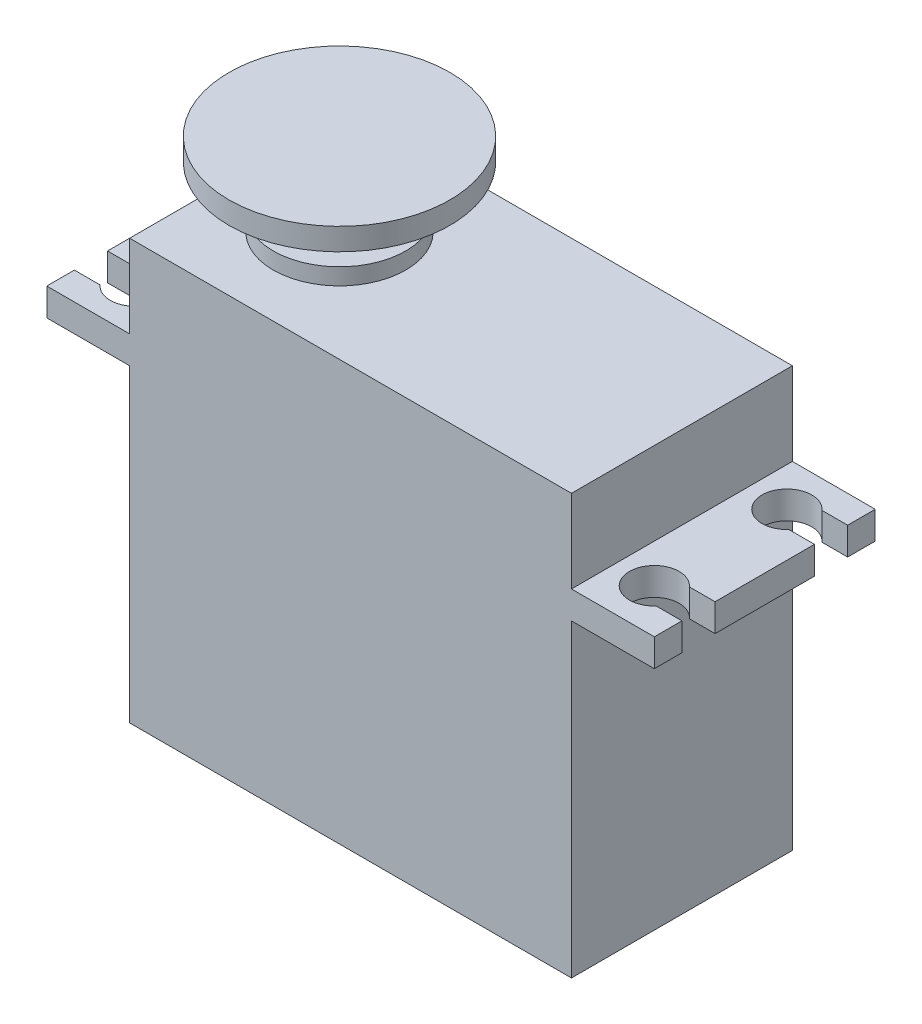
ISO-10303-21;
HEADER;
FILE_DESCRIPTION(('STEP AP214'),'2;1');
FILE_NAME('part.step','',(''),(''),'','','');
FILE_SCHEMA(('AUTOMOTIVE_DESIGN { 1 0 10303 214 1 1 1 1 }'));
ENDSEC;
DATA;
#1=APPLICATION_CONTEXT('core data for automotive mechanical design processes');
#2=APPLICATION_PROTOCOL_DEFINITION('international standard','automotive_design',2000,#1);
#3=PRODUCT_CONTEXT('',#1,'mechanical');
#4=PRODUCT('Part','Part','',(#3));
#5=PRODUCT_RELATED_PRODUCT_CATEGORY('part','',(#4));
#6=PRODUCT_DEFINITION_FORMATION('','',#4);
#7=PRODUCT_DEFINITION_CONTEXT('part definition',#1,'design');
#8=PRODUCT_DEFINITION('design','',#6,#7);
#9=PRODUCT_DEFINITION_SHAPE('','',#8);
#10=(LENGTH_UNIT() NAMED_UNIT(*) SI_UNIT(.MILLI.,.METRE.));
#11=(NAMED_UNIT(*) PLANE_ANGLE_UNIT() SI_UNIT($,.RADIAN.));
#12=(NAMED_UNIT(*) SI_UNIT($,.STERADIAN.) SOLID_ANGLE_UNIT());
#13=UNCERTAINTY_MEASURE_WITH_UNIT(LENGTH_MEASURE(1.E-05),#10,'distance_accuracy_value','');
#14=(GEOMETRIC_REPRESENTATION_CONTEXT(3) GLOBAL_UNCERTAINTY_ASSIGNED_CONTEXT((#13)) GLOBAL_UNIT_ASSIGNED_CONTEXT((#10,
#11,#12)) REPRESENTATION_CONTEXT('',''));
#15=CARTESIAN_POINT('',(0.,0.,0.));
#16=DIRECTION('',(0.,0.,1.));
#17=DIRECTION('',(1.,0.,0.));
#18=AXIS2_PLACEMENT_3D('',#15,#16,#17);
#19=CARTESIAN_POINT('',(-11.,45.5,0.));
#20=DIRECTION('',(0.,-1.,0.));
#21=DIRECTION('',(0.,0.,-1.));
#22=AXIS2_PLACEMENT_3D('',#19,#20,#21);
#23=CYLINDRICAL_SURFACE('',#22,10.);
#24=CARTESIAN_POINT('',(-11.,45.5,0.));
#25=DIRECTION('',(0.,1.,0.));
#26=DIRECTION('',(0.,0.,1.));
#27=AXIS2_PLACEMENT_3D('',#24,#25,#26);
#28=CIRCLE('',#27,10.);
#29=CARTESIAN_POINT('',(-11.,45.5,10.));
#30=VERTEX_POINT('',#29);
#31=EDGE_CURVE('E11',#30,#30,#28,.T.);
#32=ORIENTED_EDGE('',*,*,#31,.F.);
#33=EDGE_LOOP('',(#32));
#34=FACE_BOUND('',#33,.T.);
#35=CARTESIAN_POINT('',(-11.,43.5,0.));
#36=DIRECTION('',(0.,1.,0.));
#37=DIRECTION('',(0.,0.,1.));
#38=AXIS2_PLACEMENT_3D('',#35,#36,#37);
#39=CIRCLE('',#38,10.);
#40=CARTESIAN_POINT('',(-11.,43.5,10.));
#41=VERTEX_POINT('',#40);
#42=EDGE_CURVE('E45',#41,#41,#39,.T.);
#43=ORIENTED_EDGE('',*,*,#42,.T.);
#44=EDGE_LOOP('',(#43));
#45=FACE_BOUND('',#44,.T.);
#46=ADVANCED_FACE('F42',(#34,#45),#23,.T.);
#47=CARTESIAN_POINT('',(-11.,45.5,0.));
#48=DIRECTION('',(0.,1.,0.));
#49=DIRECTION('',(0.,0.,1.));
#50=AXIS2_PLACEMENT_3D('',#47,#48,#49);
#51=PLANE('',#50);
#52=ORIENTED_EDGE('',*,*,#31,.T.);
#53=EDGE_LOOP('',(#52));
#54=FACE_BOUND('',#53,.T.);
#55=ADVANCED_FACE('F57',(#54),#51,.T.);
#56=CARTESIAN_POINT('',(-11.,43.5,0.));
#57=DIRECTION('',(0.,1.,0.));
#58=DIRECTION('',(0.,0.,1.));
#59=AXIS2_PLACEMENT_3D('',#56,#57,#58);
#60=PLANE('',#59);
#61=ORIENTED_EDGE('',*,*,#42,.F.);
#62=EDGE_LOOP('',(#61));
#63=FACE_BOUND('',#62,.T.);
#64=ADVANCED_FACE('F55',(#63),#60,.F.);
#65=CLOSED_SHELL('',(#46,#55,#64));
#66=MANIFOLD_SOLID_BREP('B2',#65);
#67=CARTESIAN_POINT('',(-27.5,0.,0.));
#68=DIRECTION('',(-1.,0.,0.));
#69=DIRECTION('',(0.,0.,-1.));
#70=AXIS2_PLACEMENT_3D('',#67,#68,#69);
#71=PLANE('',#70);
#72=DIRECTION('',(0.,0.,-1.));
#73=VECTOR('',#72,1.);
#74=CARTESIAN_POINT('',(-27.5,28.,10.));
#75=LINE('',#74,#73);
#76=CARTESIAN_POINT('',(-27.5,28.,-7.5));
#77=VERTEX_POINT('',#76);
#78=CARTESIAN_POINT('',(-27.5,28.,-10.));
#79=VERTEX_POINT('',#78);
#80=EDGE_CURVE('E330',#77,#79,#75,.T.);
#81=ORIENTED_EDGE('',*,*,#80,.F.);
#82=DIRECTION('',(0.,1.,0.));
#83=VECTOR('',#82,1.);
#84=CARTESIAN_POINT('',(-27.5,0.,-7.5));
#85=LINE('',#84,#83);
#86=CARTESIAN_POINT('',(-27.5,30.5,-7.5));
#87=VERTEX_POINT('',#86);
#88=EDGE_CURVE('E476',#77,#87,#85,.T.);
#89=ORIENTED_EDGE('',*,*,#88,.T.);
#90=DIRECTION('',(0.,0.,1.));
#91=VECTOR('',#90,1.);
#92=CARTESIAN_POINT('',(-27.5,30.5,-10.));
#93=LINE('',#92,#91);
#94=CARTESIAN_POINT('',(-27.5,30.5,-10.));
#95=VERTEX_POINT('',#94);
#96=EDGE_CURVE('E324',#95,#87,#93,.T.);
#97=ORIENTED_EDGE('',*,*,#96,.F.);
#98=DIRECTION('',(0.,1.,0.));
#99=VECTOR('',#98,1.);
#100=CARTESIAN_POINT('',(-27.5,28.,-10.));
#101=LINE('',#100,#99);
#102=EDGE_CURVE('E326',#79,#95,#101,.T.);
#103=ORIENTED_EDGE('',*,*,#102,.F.);
#104=EDGE_LOOP('',(#81,#89,#97,#103));
#105=FACE_BOUND('',#104,.T.);
#106=ADVANCED_FACE('F82',(#105),#71,.T.);
#107=CARTESIAN_POINT('',(-27.5,30.5,-10.));
#108=DIRECTION('',(0.,1.,0.));
#109=DIRECTION('',(0.,0.,1.));
#110=AXIS2_PLACEMENT_3D('',#107,#108,#109);
#111=PLANE('',#110);
#112=DIRECTION('',(1.,0.,0.));
#113=VECTOR('',#112,1.);
#114=CARTESIAN_POINT('',(0.,30.5,-4.5));
#115=LINE('',#114,#113);
#116=CARTESIAN_POINT('',(-27.5,30.5,-4.5));
#117=VERTEX_POINT('',#116);
#118=CARTESIAN_POINT('',(-25.1770509831248,30.5,-4.5));
#119=VERTEX_POINT('',#118);
#120=EDGE_CURVE('E281',#117,#119,#115,.T.);
#121=ORIENTED_EDGE('',*,*,#120,.F.);
#122=CARTESIAN_POINT('',(-27.5,30.5,4.5));
#123=VERTEX_POINT('',#122);
#124=EDGE_CURVE('E327',#117,#123,#93,.T.);
#125=ORIENTED_EDGE('',*,*,#124,.T.);
#126=DIRECTION('',(1.,0.,0.));
#127=VECTOR('',#126,1.);
#128=CARTESIAN_POINT('',(0.,30.5,4.5));
#129=LINE('',#128,#127);
#130=CARTESIAN_POINT('',(-25.1770509831248,30.5,4.5));
#131=VERTEX_POINT('',#130);
#132=EDGE_CURVE('E301',#123,#131,#129,.T.);
#133=ORIENTED_EDGE('',*,*,#132,.T.);
#134=CARTESIAN_POINT('',(-23.5,30.5,6.));
#135=DIRECTION('',(0.,-1.,0.));
#136=DIRECTION('',(0.,0.,1.));
#137=AXIS2_PLACEMENT_3D('',#134,#135,#136);
#138=CIRCLE('',#137,2.25);
#139=CARTESIAN_POINT('',(-25.1770509831248,30.5,7.5));
#140=VERTEX_POINT('',#139);
#141=EDGE_CURVE('E307',#131,#140,#138,.T.);
#142=ORIENTED_EDGE('',*,*,#141,.T.);
#143=DIRECTION('',(1.,0.,0.));
#144=VECTOR('',#143,1.);
#145=CARTESIAN_POINT('',(0.,30.5,7.5));
#146=LINE('',#145,#144);
#147=CARTESIAN_POINT('',(-27.5,30.5,7.5));
#148=VERTEX_POINT('',#147);
#149=EDGE_CURVE('E304',#148,#140,#146,.T.);
#150=ORIENTED_EDGE('',*,*,#149,.F.);
#151=CARTESIAN_POINT('',(-27.5,30.5,10.));
#152=VERTEX_POINT('',#151);
#153=EDGE_CURVE('E322',#148,#152,#93,.T.);
#154=ORIENTED_EDGE('',*,*,#153,.T.);
#155=DIRECTION('',(1.,0.,0.));
#156=VECTOR('',#155,1.);
#157=CARTESIAN_POINT('',(-27.5,30.5,10.));
#158=LINE('',#157,#156);
#159=CARTESIAN_POINT('',(-20.,30.5,10.));
#160=VERTEX_POINT('',#159);
#161=EDGE_CURVE('E345',#152,#160,#158,.T.);
#162=ORIENTED_EDGE('',*,*,#161,.T.);
#163=DIRECTION('',(0.,0.,1.));
#164=VECTOR('',#163,1.);
#165=CARTESIAN_POINT('',(-20.,30.5,-10.));
#166=LINE('',#165,#164);
#167=CARTESIAN_POINT('',(-20.,30.5,-10.));
#168=VERTEX_POINT('',#167);
#169=EDGE_CURVE('E318',#168,#160,#166,.T.);
#170=ORIENTED_EDGE('',*,*,#169,.F.);
#171=DIRECTION('',(1.,0.,0.));
#172=VECTOR('',#171,1.);
#173=CARTESIAN_POINT('',(-27.5,30.5,-10.));
#174=LINE('',#173,#172);
#175=EDGE_CURVE('E343',#95,#168,#174,.T.);
#176=ORIENTED_EDGE('',*,*,#175,.F.);
#177=ORIENTED_EDGE('',*,*,#96,.T.);
#178=DIRECTION('',(1.,0.,0.));
#179=VECTOR('',#178,1.);
#180=CARTESIAN_POINT('',(0.,30.5,-7.5));
#181=LINE('',#180,#179);
#182=CARTESIAN_POINT('',(-25.1770509831248,30.5,-7.5));
#183=VERTEX_POINT('',#182);
#184=EDGE_CURVE('E98',#87,#183,#181,.T.);
#185=ORIENTED_EDGE('',*,*,#184,.T.);
#186=CARTESIAN_POINT('',(-23.5,30.5,-6.));
#187=DIRECTION('',(0.,1.,0.));
#188=DIRECTION('',(0.,0.,-1.));
#189=AXIS2_PLACEMENT_3D('',#186,#187,#188);
#190=CIRCLE('',#189,2.25);
#191=EDGE_CURVE('E274',#119,#183,#190,.T.);
#192=ORIENTED_EDGE('',*,*,#191,.F.);
#193=EDGE_LOOP('',(#121,#125,#133,#142,#150,#154,#162,#170,#176,#177,#185,#192));
#194=FACE_BOUND('',#193,.T.);
#195=ADVANCED_FACE('F289',(#194),#111,.T.);
#196=CARTESIAN_POINT('',(-27.5,28.,10.));
#197=DIRECTION('',(0.,-1.,0.));
#198=DIRECTION('',(0.,0.,-1.));
#199=AXIS2_PLACEMENT_3D('',#196,#197,#198);
#200=PLANE('',#199);
#201=DIRECTION('',(-1.,0.,0.));
#202=VECTOR('',#201,1.);
#203=CARTESIAN_POINT('',(-27.5,28.,-4.5));
#204=LINE('',#203,#202);
#205=CARTESIAN_POINT('',(-25.1770509831248,28.,-4.5));
#206=VERTEX_POINT('',#205);
#207=CARTESIAN_POINT('',(-27.5,28.,-4.5));
#208=VERTEX_POINT('',#207);
#209=EDGE_CURVE('E299',#206,#208,#204,.T.);
#210=ORIENTED_EDGE('',*,*,#209,.F.);
#211=CARTESIAN_POINT('',(-23.5,28.,-6.));
#212=DIRECTION('',(0.,-1.,0.));
#213=DIRECTION('',(0.,0.,-1.));
#214=AXIS2_PLACEMENT_3D('',#211,#212,#213);
#215=CIRCLE('',#214,2.25);
#216=CARTESIAN_POINT('',(-25.1770509831248,28.,-7.5));
#217=VERTEX_POINT('',#216);
#218=EDGE_CURVE('E86',#217,#206,#215,.T.);
#219=ORIENTED_EDGE('',*,*,#218,.F.);
#220=DIRECTION('',(-1.,0.,0.));
#221=VECTOR('',#220,1.);
#222=CARTESIAN_POINT('',(-27.5,28.,-7.5));
#223=LINE('',#222,#221);
#224=EDGE_CURVE('E295',#217,#77,#223,.T.);
#225=ORIENTED_EDGE('',*,*,#224,.T.);
#226=ORIENTED_EDGE('',*,*,#80,.T.);
#227=DIRECTION('',(1.,0.,0.));
#228=VECTOR('',#227,1.);
#229=CARTESIAN_POINT('',(-27.5,28.,-10.));
#230=LINE('',#229,#228);
#231=CARTESIAN_POINT('',(-20.,28.,-10.));
#232=VERTEX_POINT('',#231);
#233=EDGE_CURVE('E341',#79,#232,#230,.T.);
#234=ORIENTED_EDGE('',*,*,#233,.T.);
#235=DIRECTION('',(0.,0.,-1.));
#236=VECTOR('',#235,1.);
#237=CARTESIAN_POINT('',(-20.,28.,10.));
#238=LINE('',#237,#236);
#239=CARTESIAN_POINT('',(-20.,28.,10.));
#240=VERTEX_POINT('',#239);
#241=EDGE_CURVE('E323',#240,#232,#238,.T.);
#242=ORIENTED_EDGE('',*,*,#241,.F.);
#243=DIRECTION('',(1.,0.,0.));
#244=VECTOR('',#243,1.);
#245=CARTESIAN_POINT('',(-27.5,28.,10.));
#246=LINE('',#245,#244);
#247=CARTESIAN_POINT('',(-27.5,28.,10.));
#248=VERTEX_POINT('',#247);
#249=EDGE_CURVE('E334',#248,#240,#246,.T.);
#250=ORIENTED_EDGE('',*,*,#249,.F.);
#251=CARTESIAN_POINT('',(-27.5,28.,7.5));
#252=VERTEX_POINT('',#251);
#253=EDGE_CURVE('E331',#248,#252,#75,.T.);
#254=ORIENTED_EDGE('',*,*,#253,.T.);
#255=DIRECTION('',(-1.,0.,0.));
#256=VECTOR('',#255,1.);
#257=CARTESIAN_POINT('',(-27.5,28.,7.5));
#258=LINE('',#257,#256);
#259=CARTESIAN_POINT('',(-25.1770509831248,28.,7.5));
#260=VERTEX_POINT('',#259);
#261=EDGE_CURVE('E106',#260,#252,#258,.T.);
#262=ORIENTED_EDGE('',*,*,#261,.F.);
#263=CARTESIAN_POINT('',(-23.5,28.,6.));
#264=DIRECTION('',(0.,-1.,0.));
#265=DIRECTION('',(0.,0.,-1.));
#266=AXIS2_PLACEMENT_3D('',#263,#264,#265);
#267=CIRCLE('',#266,2.25);
#268=CARTESIAN_POINT('',(-25.1770509831248,28.,4.5));
#269=VERTEX_POINT('',#268);
#270=EDGE_CURVE('E473',#260,#269,#267,.F.);
#271=ORIENTED_EDGE('',*,*,#270,.T.);
#272=DIRECTION('',(-1.,0.,0.));
#273=VECTOR('',#272,1.);
#274=CARTESIAN_POINT('',(-27.5,28.,4.5));
#275=LINE('',#274,#273);
#276=CARTESIAN_POINT('',(-27.5,28.,4.5));
#277=VERTEX_POINT('',#276);
#278=EDGE_CURVE('E315',#269,#277,#275,.T.);
#279=ORIENTED_EDGE('',*,*,#278,.T.);
#280=EDGE_CURVE('E335',#277,#208,#75,.T.);
#281=ORIENTED_EDGE('',*,*,#280,.T.);
#282=EDGE_LOOP('',(#210,#219,#225,#226,#234,#242,#250,#254,#262,#271,#279,#281));
#283=FACE_BOUND('',#282,.T.);
#284=ADVANCED_FACE('F490',(#283),#200,.T.);
#285=DIRECTION('',(0.,1.,0.));
#286=VECTOR('',#285,1.);
#287=CARTESIAN_POINT('',(-27.5,0.,-4.5));
#288=LINE('',#287,#286);
#289=EDGE_CURVE('E284',#208,#117,#288,.T.);
#290=ORIENTED_EDGE('',*,*,#289,.F.);
#291=ORIENTED_EDGE('',*,*,#280,.F.);
#292=DIRECTION('',(0.,1.,0.));
#293=VECTOR('',#292,1.);
#294=CARTESIAN_POINT('',(-27.5,0.,4.5));
#295=LINE('',#294,#293);
#296=EDGE_CURVE('E470',#277,#123,#295,.T.);
#297=ORIENTED_EDGE('',*,*,#296,.T.);
#298=ORIENTED_EDGE('',*,*,#124,.F.);
#299=EDGE_LOOP('',(#290,#291,#297,#298));
#300=FACE_BOUND('',#299,.T.);
#301=ADVANCED_FACE('F517',(#300),#71,.T.);
#302=CARTESIAN_POINT('',(-20.,38.,-10.));
#303=DIRECTION('',(1.,0.,0.));
#304=DIRECTION('',(0.,0.,-1.));
#305=AXIS2_PLACEMENT_3D('',#302,#303,#304);
#306=PLANE('',#305);
#307=DIRECTION('',(0.,-1.,0.));
#308=VECTOR('',#307,1.);
#309=CARTESIAN_POINT('',(-20.,38.,10.));
#310=LINE('',#309,#308);
#311=CARTESIAN_POINT('',(-20.,0.,10.));
#312=VERTEX_POINT('',#311);
#313=EDGE_CURVE('E445',#240,#312,#310,.T.);
#314=ORIENTED_EDGE('',*,*,#313,.F.);
#315=ORIENTED_EDGE('',*,*,#241,.T.);
#316=DIRECTION('',(0.,-1.,0.));
#317=VECTOR('',#316,1.);
#318=CARTESIAN_POINT('',(-20.,38.,-10.));
#319=LINE('',#318,#317);
#320=CARTESIAN_POINT('',(-20.,0.,-10.));
#321=VERTEX_POINT('',#320);
#322=EDGE_CURVE('E449',#232,#321,#319,.T.);
#323=ORIENTED_EDGE('',*,*,#322,.T.);
#324=DIRECTION('',(0.,0.,1.));
#325=VECTOR('',#324,1.);
#326=CARTESIAN_POINT('',(-20.,0.,-10.));
#327=LINE('',#326,#325);
#328=EDGE_CURVE('E438',#321,#312,#327,.T.);
#329=ORIENTED_EDGE('',*,*,#328,.T.);
#330=EDGE_LOOP('',(#314,#315,#323,#329));
#331=FACE_BOUND('',#330,.T.);
#332=ADVANCED_FACE('F493',(#331),#306,.F.);
#333=CARTESIAN_POINT('',(27.5,28.,10.));
#334=DIRECTION('',(0.,1.,0.));
#335=DIRECTION('',(0.,0.,1.));
#336=AXIS2_PLACEMENT_3D('',#333,#334,#335);
#337=PLANE('',#336);
#338=DIRECTION('',(-1.,0.,0.));
#339=VECTOR('',#338,1.);
#340=CARTESIAN_POINT('',(27.5,28.,-4.5));
#341=LINE('',#340,#339);
#342=CARTESIAN_POINT('',(27.5,28.,-4.5));
#343=VERTEX_POINT('',#342);
#344=CARTESIAN_POINT('',(25.1770509831248,28.,-4.5));
#345=VERTEX_POINT('',#344);
#346=EDGE_CURVE('E363',#343,#345,#341,.T.);
#347=ORIENTED_EDGE('',*,*,#346,.F.);
#348=DIRECTION('',(0.,0.,-1.));
#349=VECTOR('',#348,1.);
#350=CARTESIAN_POINT('',(27.5,28.,10.));
#351=LINE('',#350,#349);
#352=CARTESIAN_POINT('',(27.5,28.,4.5));
#353=VERTEX_POINT('',#352);
#354=EDGE_CURVE('E398',#353,#343,#351,.T.);
#355=ORIENTED_EDGE('',*,*,#354,.F.);
#356=DIRECTION('',(-1.,0.,0.));
#357=VECTOR('',#356,1.);
#358=CARTESIAN_POINT('',(27.5,28.,4.5));
#359=LINE('',#358,#357);
#360=CARTESIAN_POINT('',(25.1770509831248,28.,4.5));
#361=VERTEX_POINT('',#360);
#362=EDGE_CURVE('E382',#353,#361,#359,.T.);
#363=ORIENTED_EDGE('',*,*,#362,.T.);
#364=CARTESIAN_POINT('',(23.5,28.,6.));
#365=DIRECTION('',(0.,1.,0.));
#366=DIRECTION('',(0.,0.,1.));
#367=AXIS2_PLACEMENT_3D('',#364,#365,#366);
#368=CIRCLE('',#367,2.25);
#369=CARTESIAN_POINT('',(25.1770509831248,28.,7.5));
#370=VERTEX_POINT('',#369);
#371=EDGE_CURVE('E385',#361,#370,#368,.T.);
#372=ORIENTED_EDGE('',*,*,#371,.T.);
#373=DIRECTION('',(-1.,0.,0.));
#374=VECTOR('',#373,1.);
#375=CARTESIAN_POINT('',(27.5,28.,7.5));
#376=LINE('',#375,#374);
#377=CARTESIAN_POINT('',(27.5,28.,7.5));
#378=VERTEX_POINT('',#377);
#379=EDGE_CURVE('E379',#378,#370,#376,.T.);
#380=ORIENTED_EDGE('',*,*,#379,.F.);
#381=CARTESIAN_POINT('',(27.5,28.,10.));
#382=VERTEX_POINT('',#381);
#383=EDGE_CURVE('E394',#382,#378,#351,.T.);
#384=ORIENTED_EDGE('',*,*,#383,.F.);
#385=DIRECTION('',(-1.,0.,0.));
#386=VECTOR('',#385,1.);
#387=CARTESIAN_POINT('',(27.5,28.,10.));
#388=LINE('',#387,#386);
#389=CARTESIAN_POINT('',(20.,28.,10.));
#390=VERTEX_POINT('',#389);
#391=EDGE_CURVE('E418',#382,#390,#388,.T.);
#392=ORIENTED_EDGE('',*,*,#391,.T.);
#393=DIRECTION('',(0.,0.,-1.));
#394=VECTOR('',#393,1.);
#395=CARTESIAN_POINT('',(20.,28.,10.));
#396=LINE('',#395,#394);
#397=CARTESIAN_POINT('',(20.,28.,-10.));
#398=VERTEX_POINT('',#397);
#399=EDGE_CURVE('E388',#390,#398,#396,.T.);
#400=ORIENTED_EDGE('',*,*,#399,.T.);
#401=DIRECTION('',(-1.,0.,0.));
#402=VECTOR('',#401,1.);
#403=CARTESIAN_POINT('',(27.5,28.,-10.));
#404=LINE('',#403,#402);
#405=CARTESIAN_POINT('',(27.5,28.,-10.));
#406=VERTEX_POINT('',#405);
#407=EDGE_CURVE('E415',#406,#398,#404,.T.);
#408=ORIENTED_EDGE('',*,*,#407,.F.);
#409=CARTESIAN_POINT('',(27.5,28.,-7.5));
#410=VERTEX_POINT('',#409);
#411=EDGE_CURVE('E392',#410,#406,#351,.T.);
#412=ORIENTED_EDGE('',*,*,#411,.F.);
#413=DIRECTION('',(-1.,0.,0.));
#414=VECTOR('',#413,1.);
#415=CARTESIAN_POINT('',(27.5,28.,-7.5));
#416=LINE('',#415,#414);
#417=CARTESIAN_POINT('',(25.1770509831248,28.,-7.5));
#418=VERTEX_POINT('',#417);
#419=EDGE_CURVE('E359',#410,#418,#416,.T.);
#420=ORIENTED_EDGE('',*,*,#419,.T.);
#421=CARTESIAN_POINT('',(23.5,28.,-6.));
#422=DIRECTION('',(0.,1.,0.));
#423=DIRECTION('',(0.,0.,1.));
#424=AXIS2_PLACEMENT_3D('',#421,#422,#423);
#425=CIRCLE('',#424,2.25);
#426=EDGE_CURVE('E365',#345,#418,#425,.F.);
#427=ORIENTED_EDGE('',*,*,#426,.F.);
#428=EDGE_LOOP('',(#347,#355,#363,#372,#380,#384,#392,#400,#408,#412,#420,#427));
#429=FACE_BOUND('',#428,.T.);
#430=ADVANCED_FACE('F540',(#429),#337,.F.);
#431=CARTESIAN_POINT('',(27.5,30.5,-10.));
#432=DIRECTION('',(0.,-1.,0.));
#433=DIRECTION('',(0.,0.,-1.));
#434=AXIS2_PLACEMENT_3D('',#431,#432,#433);
#435=PLANE('',#434);
#436=DIRECTION('',(-1.,0.,0.));
#437=VECTOR('',#436,1.);
#438=CARTESIAN_POINT('',(0.,30.5,-4.5));
#439=LINE('',#438,#437);
#440=CARTESIAN_POINT('',(27.5,30.5,-4.5));
#441=VERTEX_POINT('',#440);
#442=CARTESIAN_POINT('',(25.1770509831248,30.5,-4.5));
#443=VERTEX_POINT('',#442);
#444=EDGE_CURVE('E347',#441,#443,#439,.T.);
#445=ORIENTED_EDGE('',*,*,#444,.T.);
#446=CARTESIAN_POINT('',(23.5,30.5,-6.));
#447=DIRECTION('',(0.,-1.,0.));
#448=DIRECTION('',(0.,0.,-1.));
#449=AXIS2_PLACEMENT_3D('',#446,#447,#448);
#450=CIRCLE('',#449,2.25);
#451=CARTESIAN_POINT('',(25.1770509831248,30.5,-7.5));
#452=VERTEX_POINT('',#451);
#453=EDGE_CURVE('E353',#443,#452,#450,.T.);
#454=ORIENTED_EDGE('',*,*,#453,.T.);
#455=DIRECTION('',(-1.,0.,0.));
#456=VECTOR('',#455,1.);
#457=CARTESIAN_POINT('',(0.,30.5,-7.5));
#458=LINE('',#457,#456);
#459=CARTESIAN_POINT('',(27.5,30.5,-7.5));
#460=VERTEX_POINT('',#459);
#461=EDGE_CURVE('E350',#460,#452,#458,.T.);
#462=ORIENTED_EDGE('',*,*,#461,.F.);
#463=DIRECTION('',(0.,0.,1.));
#464=VECTOR('',#463,1.);
#465=CARTESIAN_POINT('',(27.5,30.5,-10.));
#466=LINE('',#465,#464);
#467=CARTESIAN_POINT('',(27.5,30.5,-10.));
#468=VERTEX_POINT('',#467);
#469=EDGE_CURVE('E401',#468,#460,#466,.T.);
#470=ORIENTED_EDGE('',*,*,#469,.F.);
#471=DIRECTION('',(-1.,0.,0.));
#472=VECTOR('',#471,1.);
#473=CARTESIAN_POINT('',(27.5,30.5,-10.));
#474=LINE('',#473,#472);
#475=CARTESIAN_POINT('',(20.,30.5,-10.));
#476=VERTEX_POINT('',#475);
#477=EDGE_CURVE('E412',#468,#476,#474,.T.);
#478=ORIENTED_EDGE('',*,*,#477,.T.);
#479=DIRECTION('',(0.,0.,1.));
#480=VECTOR('',#479,1.);
#481=CARTESIAN_POINT('',(20.,30.5,-10.));
#482=LINE('',#481,#480);
#483=CARTESIAN_POINT('',(20.,30.5,10.));
#484=VERTEX_POINT('',#483);
#485=EDGE_CURVE('E393',#476,#484,#482,.T.);
#486=ORIENTED_EDGE('',*,*,#485,.T.);
#487=DIRECTION('',(-1.,0.,0.));
#488=VECTOR('',#487,1.);
#489=CARTESIAN_POINT('',(27.5,30.5,10.));
#490=LINE('',#489,#488);
#491=CARTESIAN_POINT('',(27.5,30.5,10.));
#492=VERTEX_POINT('',#491);
#493=EDGE_CURVE('E404',#492,#484,#490,.T.);
#494=ORIENTED_EDGE('',*,*,#493,.F.);
#495=CARTESIAN_POINT('',(27.5,30.5,7.5));
#496=VERTEX_POINT('',#495);
#497=EDGE_CURVE('E400',#496,#492,#466,.T.);
#498=ORIENTED_EDGE('',*,*,#497,.F.);
#499=DIRECTION('',(-1.,0.,0.));
#500=VECTOR('',#499,1.);
#501=CARTESIAN_POINT('',(0.,30.5,7.5));
#502=LINE('',#501,#500);
#503=CARTESIAN_POINT('',(25.1770509831248,30.5,7.5));
#504=VERTEX_POINT('',#503);
#505=EDGE_CURVE('E373',#496,#504,#502,.T.);
#506=ORIENTED_EDGE('',*,*,#505,.T.);
#507=CARTESIAN_POINT('',(23.5,30.5,6.));
#508=DIRECTION('',(0.,1.,0.));
#509=DIRECTION('',(0.,0.,1.));
#510=AXIS2_PLACEMENT_3D('',#507,#508,#509);
#511=CIRCLE('',#510,2.25);
#512=CARTESIAN_POINT('',(25.1770509831248,30.5,4.5));
#513=VERTEX_POINT('',#512);
#514=EDGE_CURVE('E370',#513,#504,#511,.T.);
#515=ORIENTED_EDGE('',*,*,#514,.F.);
#516=DIRECTION('',(-1.,0.,0.));
#517=VECTOR('',#516,1.);
#518=CARTESIAN_POINT('',(0.,30.5,4.5));
#519=LINE('',#518,#517);
#520=CARTESIAN_POINT('',(27.5,30.5,4.5));
#521=VERTEX_POINT('',#520);
#522=EDGE_CURVE('E367',#521,#513,#519,.T.);
#523=ORIENTED_EDGE('',*,*,#522,.F.);
#524=EDGE_CURVE('E405',#441,#521,#466,.T.);
#525=ORIENTED_EDGE('',*,*,#524,.F.);
#526=EDGE_LOOP('',(#445,#454,#462,#470,#478,#486,#494,#498,#506,#515,#523,#525));
#527=FACE_BOUND('',#526,.T.);
#528=ADVANCED_FACE('F576',(#527),#435,.F.);
#529=CARTESIAN_POINT('',(27.5,0.,0.));
#530=DIRECTION('',(1.,0.,0.));
#531=DIRECTION('',(0.,0.,-1.));
#532=AXIS2_PLACEMENT_3D('',#529,#530,#531);
#533=PLANE('',#532);
#534=ORIENTED_EDGE('',*,*,#354,.T.);
#535=DIRECTION('',(0.,1.,0.));
#536=VECTOR('',#535,1.);
#537=CARTESIAN_POINT('',(27.5,0.,-4.5));
#538=LINE('',#537,#536);
#539=EDGE_CURVE('E465',#343,#441,#538,.T.);
#540=ORIENTED_EDGE('',*,*,#539,.T.);
#541=ORIENTED_EDGE('',*,*,#524,.T.);
#542=DIRECTION('',(0.,1.,0.));
#543=VECTOR('',#542,1.);
#544=CARTESIAN_POINT('',(27.5,0.,4.5));
#545=LINE('',#544,#543);
#546=EDGE_CURVE('E460',#353,#521,#545,.T.);
#547=ORIENTED_EDGE('',*,*,#546,.F.);
#548=EDGE_LOOP('',(#534,#540,#541,#547));
#549=FACE_BOUND('',#548,.T.);
#550=ADVANCED_FACE('F574',(#549),#533,.T.);
#551=ORIENTED_EDGE('',*,*,#383,.T.);
#552=DIRECTION('',(0.,1.,0.));
#553=VECTOR('',#552,1.);
#554=CARTESIAN_POINT('',(27.5,0.,7.5));
#555=LINE('',#554,#553);
#556=EDGE_CURVE('E457',#378,#496,#555,.T.);
#557=ORIENTED_EDGE('',*,*,#556,.T.);
#558=ORIENTED_EDGE('',*,*,#497,.T.);
#559=DIRECTION('',(0.,-1.,0.));
#560=VECTOR('',#559,1.);
#561=CARTESIAN_POINT('',(27.5,30.5,10.));
#562=LINE('',#561,#560);
#563=EDGE_CURVE('E389',#492,#382,#562,.T.);
#564=ORIENTED_EDGE('',*,*,#563,.T.);
#565=EDGE_LOOP('',(#551,#557,#558,#564));
#566=FACE_BOUND('',#565,.T.);
#567=ADVANCED_FACE('F575',(#566),#533,.T.);
#568=CARTESIAN_POINT('',(20.,38.,-10.));
#569=DIRECTION('',(-1.,0.,0.));
#570=DIRECTION('',(0.,0.,1.));
#571=AXIS2_PLACEMENT_3D('',#568,#569,#570);
#572=PLANE('',#571);
#573=ORIENTED_EDGE('',*,*,#485,.F.);
#574=DIRECTION('',(0.,-1.,0.));
#575=VECTOR('',#574,1.);
#576=CARTESIAN_POINT('',(20.,38.,-10.));
#577=LINE('',#576,#575);
#578=CARTESIAN_POINT('',(20.,38.,-10.));
#579=VERTEX_POINT('',#578);
#580=EDGE_CURVE('E454',#579,#476,#577,.T.);
#581=ORIENTED_EDGE('',*,*,#580,.F.);
#582=DIRECTION('',(0.,0.,-1.));
#583=VECTOR('',#582,1.);
#584=CARTESIAN_POINT('',(20.,38.,-10.));
#585=LINE('',#584,#583);
#586=CARTESIAN_POINT('',(20.,38.,10.));
#587=VERTEX_POINT('',#586);
#588=EDGE_CURVE('E422',#587,#579,#585,.T.);
#589=ORIENTED_EDGE('',*,*,#588,.F.);
#590=DIRECTION('',(0.,-1.,0.));
#591=VECTOR('',#590,1.);
#592=CARTESIAN_POINT('',(20.,38.,10.));
#593=LINE('',#592,#591);
#594=EDGE_CURVE('E443',#587,#484,#593,.T.);
#595=ORIENTED_EDGE('',*,*,#594,.T.);
#596=EDGE_LOOP('',(#573,#581,#589,#595));
#597=FACE_BOUND('',#596,.T.);
#598=ADVANCED_FACE('F84',(#597),#572,.F.);
#599=ORIENTED_EDGE('',*,*,#399,.F.);
#600=CARTESIAN_POINT('',(20.,0.,10.));
#601=VERTEX_POINT('',#600);
#602=EDGE_CURVE('E432',#390,#601,#593,.T.);
#603=ORIENTED_EDGE('',*,*,#602,.T.);
#604=DIRECTION('',(0.,0.,-1.));
#605=VECTOR('',#604,1.);
#606=CARTESIAN_POINT('',(20.,0.,-10.));
#607=LINE('',#606,#605);
#608=CARTESIAN_POINT('',(20.,0.,-10.));
#609=VERTEX_POINT('',#608);
#610=EDGE_CURVE('E421',#601,#609,#607,.T.);
#611=ORIENTED_EDGE('',*,*,#610,.T.);
#612=EDGE_CURVE('E453',#398,#609,#577,.T.);
#613=ORIENTED_EDGE('',*,*,#612,.F.);
#614=EDGE_LOOP('',(#599,#603,#611,#613));
#615=FACE_BOUND('',#614,.T.);
#616=ADVANCED_FACE('F594',(#615),#572,.F.);
#617=CARTESIAN_POINT('',(-20.,38.,-10.));
#618=DIRECTION('',(0.,0.,1.));
#619=DIRECTION('',(1.,0.,0.));
#620=AXIS2_PLACEMENT_3D('',#617,#618,#619);
#621=PLANE('',#620);
#622=DIRECTION('',(-1.,0.,0.));
#623=VECTOR('',#622,1.);
#624=CARTESIAN_POINT('',(-20.,0.,-10.));
#625=LINE('',#624,#623);
#626=EDGE_CURVE('E435',#609,#321,#625,.T.);
#627=ORIENTED_EDGE('',*,*,#626,.T.);
#628=ORIENTED_EDGE('',*,*,#322,.F.);
#629=ORIENTED_EDGE('',*,*,#233,.F.);
#630=ORIENTED_EDGE('',*,*,#102,.T.);
#631=ORIENTED_EDGE('',*,*,#175,.T.);
#632=CARTESIAN_POINT('',(-20.,38.,-10.));
#633=VERTEX_POINT('',#632);
#634=EDGE_CURVE('E450',#633,#168,#319,.T.);
#635=ORIENTED_EDGE('',*,*,#634,.F.);
#636=DIRECTION('',(-1.,0.,0.));
#637=VECTOR('',#636,1.);
#638=CARTESIAN_POINT('',(-20.,38.,-10.));
#639=LINE('',#638,#637);
#640=EDGE_CURVE('E425',#579,#633,#639,.T.);
#641=ORIENTED_EDGE('',*,*,#640,.F.);
#642=ORIENTED_EDGE('',*,*,#580,.T.);
#643=ORIENTED_EDGE('',*,*,#477,.F.);
#644=DIRECTION('',(0.,1.,0.));
#645=VECTOR('',#644,1.);
#646=CARTESIAN_POINT('',(27.5,28.,-10.));
#647=LINE('',#646,#645);
#648=EDGE_CURVE('E397',#406,#468,#647,.T.);
#649=ORIENTED_EDGE('',*,*,#648,.F.);
#650=ORIENTED_EDGE('',*,*,#407,.T.);
#651=ORIENTED_EDGE('',*,*,#612,.T.);
#652=EDGE_LOOP('',(#627,#628,#629,#630,#631,#635,#641,#642,#643,#649,#650,#651));
#653=FACE_BOUND('',#652,.T.);
#654=ADVANCED_FACE('F484',(#653),#621,.F.);
#655=ORIENTED_EDGE('',*,*,#634,.T.);
#656=ORIENTED_EDGE('',*,*,#169,.T.);
#657=CARTESIAN_POINT('',(-20.,38.,10.));
#658=VERTEX_POINT('',#657);
#659=EDGE_CURVE('E446',#658,#160,#310,.T.);
#660=ORIENTED_EDGE('',*,*,#659,.F.);
#661=DIRECTION('',(0.,0.,1.));
#662=VECTOR('',#661,1.);
#663=CARTESIAN_POINT('',(-20.,38.,-10.));
#664=LINE('',#663,#662);
#665=EDGE_CURVE('E428',#633,#658,#664,.T.);
#666=ORIENTED_EDGE('',*,*,#665,.F.);
#667=EDGE_LOOP('',(#655,#656,#660,#666));
#668=FACE_BOUND('',#667,.T.);
#669=ADVANCED_FACE('F542',(#668),#306,.F.);
#670=CARTESIAN_POINT('',(-20.,38.,10.));
#671=DIRECTION('',(0.,0.,-1.));
#672=DIRECTION('',(-1.,0.,0.));
#673=AXIS2_PLACEMENT_3D('',#670,#671,#672);
#674=PLANE('',#673);
#675=DIRECTION('',(1.,0.,0.));
#676=VECTOR('',#675,1.);
#677=CARTESIAN_POINT('',(-20.,0.,10.));
#678=LINE('',#677,#676);
#679=EDGE_CURVE('E426',#312,#601,#678,.T.);
#680=ORIENTED_EDGE('',*,*,#679,.T.);
#681=ORIENTED_EDGE('',*,*,#602,.F.);
#682=ORIENTED_EDGE('',*,*,#391,.F.);
#683=ORIENTED_EDGE('',*,*,#563,.F.);
#684=ORIENTED_EDGE('',*,*,#493,.T.);
#685=ORIENTED_EDGE('',*,*,#594,.F.);
#686=DIRECTION('',(1.,0.,0.));
#687=VECTOR('',#686,1.);
#688=CARTESIAN_POINT('',(-20.,38.,10.));
#689=LINE('',#688,#687);
#690=EDGE_CURVE('E430',#658,#587,#689,.T.);
#691=ORIENTED_EDGE('',*,*,#690,.F.);
#692=ORIENTED_EDGE('',*,*,#659,.T.);
#693=ORIENTED_EDGE('',*,*,#161,.F.);
#694=DIRECTION('',(0.,-1.,0.));
#695=VECTOR('',#694,1.);
#696=CARTESIAN_POINT('',(-27.5,30.5,10.));
#697=LINE('',#696,#695);
#698=EDGE_CURVE('E319',#152,#248,#697,.T.);
#699=ORIENTED_EDGE('',*,*,#698,.T.);
#700=ORIENTED_EDGE('',*,*,#249,.T.);
#701=ORIENTED_EDGE('',*,*,#313,.T.);
#702=EDGE_LOOP('',(#680,#681,#682,#683,#684,#685,#691,#692,#693,#699,#700,#701));
#703=FACE_BOUND('',#702,.T.);
#704=ADVANCED_FACE('F497',(#703),#674,.F.);
#705=CARTESIAN_POINT('',(0.,38.,0.));
#706=DIRECTION('',(0.,1.,0.));
#707=DIRECTION('',(0.,0.,1.));
#708=AXIS2_PLACEMENT_3D('',#705,#706,#707);
#709=PLANE('',#708);
#710=CARTESIAN_POINT('',(-11.,38.,0.));
#711=DIRECTION('',(0.,1.,0.));
#712=DIRECTION('',(0.,0.,1.));
#713=AXIS2_PLACEMENT_3D('',#710,#711,#712);
#714=CIRCLE('',#713,6.);
#715=CARTESIAN_POINT('',(-11.,38.,6.));
#716=VERTEX_POINT('',#715);
#717=EDGE_CURVE('E836',#716,#716,#714,.T.);
#718=ORIENTED_EDGE('',*,*,#717,.F.);
#719=EDGE_LOOP('',(#718));
#720=FACE_BOUND('',#719,.T.);
#721=ORIENTED_EDGE('',*,*,#588,.T.);
#722=ORIENTED_EDGE('',*,*,#640,.T.);
#723=ORIENTED_EDGE('',*,*,#665,.T.);
#724=ORIENTED_EDGE('',*,*,#690,.T.);
#725=EDGE_LOOP('',(#721,#722,#723,#724));
#726=FACE_BOUND('',#725,.T.);
#727=ADVANCED_FACE('F583',(#720,#726),#709,.T.);
#728=CARTESIAN_POINT('',(0.,0.,0.));
#729=DIRECTION('',(0.,1.,0.));
#730=DIRECTION('',(0.,0.,1.));
#731=AXIS2_PLACEMENT_3D('',#728,#729,#730);
#732=PLANE('',#731);
#733=ORIENTED_EDGE('',*,*,#610,.F.);
#734=ORIENTED_EDGE('',*,*,#679,.F.);
#735=ORIENTED_EDGE('',*,*,#328,.F.);
#736=ORIENTED_EDGE('',*,*,#626,.F.);
#737=EDGE_LOOP('',(#733,#734,#735,#736));
#738=FACE_BOUND('',#737,.T.);
#739=ADVANCED_FACE('F572',(#738),#732,.F.);
#740=DIRECTION('',(0.,1.,0.));
#741=VECTOR('',#740,1.);
#742=CARTESIAN_POINT('',(27.5,0.,-7.5));
#743=LINE('',#742,#741);
#744=EDGE_CURVE('E463',#410,#460,#743,.T.);
#745=ORIENTED_EDGE('',*,*,#744,.F.);
#746=ORIENTED_EDGE('',*,*,#411,.T.);
#747=ORIENTED_EDGE('',*,*,#648,.T.);
#748=ORIENTED_EDGE('',*,*,#469,.T.);
#749=EDGE_LOOP('',(#745,#746,#747,#748));
#750=FACE_BOUND('',#749,.T.);
#751=ADVANCED_FACE('F565',(#750),#533,.T.);
#752=CARTESIAN_POINT('',(23.5,0.,6.));
#753=DIRECTION('',(0.,1.,0.));
#754=DIRECTION('',(0.,0.,1.));
#755=AXIS2_PLACEMENT_3D('',#752,#753,#754);
#756=CYLINDRICAL_SURFACE('',#755,2.25);
#757=DIRECTION('',(0.,1.,0.));
#758=VECTOR('',#757,1.);
#759=CARTESIAN_POINT('',(25.1770509831248,0.,4.5));
#760=LINE('',#759,#758);
#761=EDGE_CURVE('E376',#361,#513,#760,.T.);
#762=ORIENTED_EDGE('',*,*,#761,.T.);
#763=ORIENTED_EDGE('',*,*,#514,.T.);
#764=DIRECTION('',(0.,1.,0.));
#765=VECTOR('',#764,1.);
#766=CARTESIAN_POINT('',(25.1770509831248,0.,7.5));
#767=LINE('',#766,#765);
#768=EDGE_CURVE('E377',#370,#504,#767,.T.);
#769=ORIENTED_EDGE('',*,*,#768,.F.);
#770=ORIENTED_EDGE('',*,*,#371,.F.);
#771=EDGE_LOOP('',(#762,#763,#769,#770));
#772=FACE_BOUND('',#771,.T.);
#773=ADVANCED_FACE('F562',(#772),#756,.F.);
#774=CARTESIAN_POINT('',(0.,0.,4.5));
#775=DIRECTION('',(0.,0.,-1.));
#776=DIRECTION('',(0.,1.,0.));
#777=AXIS2_PLACEMENT_3D('',#774,#775,#776);
#778=PLANE('',#777);
#779=ORIENTED_EDGE('',*,*,#546,.T.);
#780=ORIENTED_EDGE('',*,*,#522,.T.);
#781=ORIENTED_EDGE('',*,*,#761,.F.);
#782=ORIENTED_EDGE('',*,*,#362,.F.);
#783=EDGE_LOOP('',(#779,#780,#781,#782));
#784=FACE_BOUND('',#783,.T.);
#785=ADVANCED_FACE('F560',(#784),#778,.F.);
#786=CARTESIAN_POINT('',(0.,0.,7.5));
#787=DIRECTION('',(0.,0.,-1.));
#788=DIRECTION('',(0.,1.,0.));
#789=AXIS2_PLACEMENT_3D('',#786,#787,#788);
#790=PLANE('',#789);
#791=ORIENTED_EDGE('',*,*,#379,.T.);
#792=ORIENTED_EDGE('',*,*,#768,.T.);
#793=ORIENTED_EDGE('',*,*,#505,.F.);
#794=ORIENTED_EDGE('',*,*,#556,.F.);
#795=EDGE_LOOP('',(#791,#792,#793,#794));
#796=FACE_BOUND('',#795,.T.);
#797=ADVANCED_FACE('F550',(#796),#790,.T.);
#798=CARTESIAN_POINT('',(23.5,0.,-6.));
#799=DIRECTION('',(0.,1.,0.));
#800=DIRECTION('',(0.,0.,1.));
#801=AXIS2_PLACEMENT_3D('',#798,#799,#800);
#802=CYLINDRICAL_SURFACE('',#801,2.25);
#803=ORIENTED_EDGE('',*,*,#426,.T.);
#804=DIRECTION('',(0.,1.,0.));
#805=VECTOR('',#804,1.);
#806=CARTESIAN_POINT('',(25.1770509831248,0.,-7.5));
#807=LINE('',#806,#805);
#808=EDGE_CURVE('E356',#418,#452,#807,.T.);
#809=ORIENTED_EDGE('',*,*,#808,.T.);
#810=ORIENTED_EDGE('',*,*,#453,.F.);
#811=DIRECTION('',(0.,1.,0.));
#812=VECTOR('',#811,1.);
#813=CARTESIAN_POINT('',(25.1770509831248,0.,-4.5));
#814=LINE('',#813,#812);
#815=EDGE_CURVE('E357',#345,#443,#814,.T.);
#816=ORIENTED_EDGE('',*,*,#815,.F.);
#817=EDGE_LOOP('',(#803,#809,#810,#816));
#818=FACE_BOUND('',#817,.T.);
#819=ADVANCED_FACE('F546',(#818),#802,.F.);
#820=CARTESIAN_POINT('',(0.,0.,-4.5));
#821=DIRECTION('',(0.,0.,-1.));
#822=DIRECTION('',(0.,1.,0.));
#823=AXIS2_PLACEMENT_3D('',#820,#821,#822);
#824=PLANE('',#823);
#825=ORIENTED_EDGE('',*,*,#346,.T.);
#826=ORIENTED_EDGE('',*,*,#815,.T.);
#827=ORIENTED_EDGE('',*,*,#444,.F.);
#828=ORIENTED_EDGE('',*,*,#539,.F.);
#829=EDGE_LOOP('',(#825,#826,#827,#828));
#830=FACE_BOUND('',#829,.T.);
#831=ADVANCED_FACE('F549',(#830),#824,.T.);
#832=CARTESIAN_POINT('',(0.,0.,-7.5));
#833=DIRECTION('',(0.,0.,-1.));
#834=DIRECTION('',(0.,1.,0.));
#835=AXIS2_PLACEMENT_3D('',#832,#833,#834);
#836=PLANE('',#835);
#837=ORIENTED_EDGE('',*,*,#744,.T.);
#838=ORIENTED_EDGE('',*,*,#461,.T.);
#839=ORIENTED_EDGE('',*,*,#808,.F.);
#840=ORIENTED_EDGE('',*,*,#419,.F.);
#841=EDGE_LOOP('',(#837,#838,#839,#840));
#842=FACE_BOUND('',#841,.T.);
#843=ADVANCED_FACE('F526',(#842),#836,.F.);
#844=DIRECTION('',(0.,1.,0.));
#845=VECTOR('',#844,1.);
#846=CARTESIAN_POINT('',(-27.5,0.,7.5));
#847=LINE('',#846,#845);
#848=EDGE_CURVE('E468',#252,#148,#847,.T.);
#849=ORIENTED_EDGE('',*,*,#848,.F.);
#850=ORIENTED_EDGE('',*,*,#253,.F.);
#851=ORIENTED_EDGE('',*,*,#698,.F.);
#852=ORIENTED_EDGE('',*,*,#153,.F.);
#853=EDGE_LOOP('',(#849,#850,#851,#852));
#854=FACE_BOUND('',#853,.T.);
#855=ADVANCED_FACE('F504',(#854),#71,.T.);
#856=CARTESIAN_POINT('',(0.,0.,4.5));
#857=DIRECTION('',(0.,0.,1.));
#858=DIRECTION('',(0.,-1.,0.));
#859=AXIS2_PLACEMENT_3D('',#856,#857,#858);
#860=PLANE('',#859);
#861=DIRECTION('',(0.,1.,0.));
#862=VECTOR('',#861,1.);
#863=CARTESIAN_POINT('',(-25.1770509831248,0.,4.5));
#864=LINE('',#863,#862);
#865=EDGE_CURVE('E311',#269,#131,#864,.T.);
#866=ORIENTED_EDGE('',*,*,#865,.T.);
#867=ORIENTED_EDGE('',*,*,#132,.F.);
#868=ORIENTED_EDGE('',*,*,#296,.F.);
#869=ORIENTED_EDGE('',*,*,#278,.F.);
#870=EDGE_LOOP('',(#866,#867,#868,#869));
#871=FACE_BOUND('',#870,.T.);
#872=ADVANCED_FACE('F518',(#871),#860,.T.);
#873=CARTESIAN_POINT('',(-23.5,0.,6.));
#874=DIRECTION('',(0.,1.,0.));
#875=DIRECTION('',(0.,0.,1.));
#876=AXIS2_PLACEMENT_3D('',#873,#874,#875);
#877=CYLINDRICAL_SURFACE('',#876,2.25);
#878=DIRECTION('',(0.,1.,0.));
#879=VECTOR('',#878,1.);
#880=CARTESIAN_POINT('',(-25.1770509831248,0.,7.5));
#881=LINE('',#880,#879);
#882=EDGE_CURVE('E310',#260,#140,#881,.T.);
#883=ORIENTED_EDGE('',*,*,#882,.T.);
#884=ORIENTED_EDGE('',*,*,#141,.F.);
#885=ORIENTED_EDGE('',*,*,#865,.F.);
#886=ORIENTED_EDGE('',*,*,#270,.F.);
#887=EDGE_LOOP('',(#883,#884,#885,#886));
#888=FACE_BOUND('',#887,.T.);
#889=ADVANCED_FACE('F512',(#888),#877,.F.);
#890=CARTESIAN_POINT('',(0.,0.,7.5));
#891=DIRECTION('',(0.,0.,1.));
#892=DIRECTION('',(0.,-1.,0.));
#893=AXIS2_PLACEMENT_3D('',#890,#891,#892);
#894=PLANE('',#893);
#895=ORIENTED_EDGE('',*,*,#261,.T.);
#896=ORIENTED_EDGE('',*,*,#848,.T.);
#897=ORIENTED_EDGE('',*,*,#149,.T.);
#898=ORIENTED_EDGE('',*,*,#882,.F.);
#899=EDGE_LOOP('',(#895,#896,#897,#898));
#900=FACE_BOUND('',#899,.T.);
#901=ADVANCED_FACE('F507',(#900),#894,.F.);
#902=CARTESIAN_POINT('',(0.,0.,-4.5));
#903=DIRECTION('',(0.,0.,1.));
#904=DIRECTION('',(0.,-1.,0.));
#905=AXIS2_PLACEMENT_3D('',#902,#903,#904);
#906=PLANE('',#905);
#907=ORIENTED_EDGE('',*,*,#209,.T.);
#908=ORIENTED_EDGE('',*,*,#289,.T.);
#909=ORIENTED_EDGE('',*,*,#120,.T.);
#910=DIRECTION('',(0.,1.,0.));
#911=VECTOR('',#910,1.);
#912=CARTESIAN_POINT('',(-25.1770509831248,0.,-4.5));
#913=LINE('',#912,#911);
#914=EDGE_CURVE('E269',#206,#119,#913,.T.);
#915=ORIENTED_EDGE('',*,*,#914,.F.);
#916=EDGE_LOOP('',(#907,#908,#909,#915));
#917=FACE_BOUND('',#916,.T.);
#918=ADVANCED_FACE('F282',(#917),#906,.F.);
#919=CARTESIAN_POINT('',(0.,0.,-7.5));
#920=DIRECTION('',(0.,0.,1.));
#921=DIRECTION('',(0.,-1.,0.));
#922=AXIS2_PLACEMENT_3D('',#919,#920,#921);
#923=PLANE('',#922);
#924=DIRECTION('',(0.,1.,0.));
#925=VECTOR('',#924,1.);
#926=CARTESIAN_POINT('',(-25.1770509831248,0.,-7.5));
#927=LINE('',#926,#925);
#928=EDGE_CURVE('E278',#217,#183,#927,.T.);
#929=ORIENTED_EDGE('',*,*,#928,.T.);
#930=ORIENTED_EDGE('',*,*,#184,.F.);
#931=ORIENTED_EDGE('',*,*,#88,.F.);
#932=ORIENTED_EDGE('',*,*,#224,.F.);
#933=EDGE_LOOP('',(#929,#930,#931,#932));
#934=FACE_BOUND('',#933,.T.);
#935=ADVANCED_FACE('F744',(#934),#923,.T.);
#936=CARTESIAN_POINT('',(-23.5,0.,-6.));
#937=DIRECTION('',(0.,1.,0.));
#938=DIRECTION('',(0.,0.,1.));
#939=AXIS2_PLACEMENT_3D('',#936,#937,#938);
#940=CYLINDRICAL_SURFACE('',#939,2.25);
#941=ORIENTED_EDGE('',*,*,#218,.T.);
#942=ORIENTED_EDGE('',*,*,#914,.T.);
#943=ORIENTED_EDGE('',*,*,#191,.T.);
#944=ORIENTED_EDGE('',*,*,#928,.F.);
#945=EDGE_LOOP('',(#941,#942,#943,#944));
#946=FACE_BOUND('',#945,.T.);
#947=ADVANCED_FACE('F271',(#946),#940,.F.);
#948=CARTESIAN_POINT('',(-11.,39.5,0.));
#949=DIRECTION('',(0.,-1.,0.));
#950=DIRECTION('',(0.,0.,-1.));
#951=AXIS2_PLACEMENT_3D('',#948,#949,#950);
#952=CYLINDRICAL_SURFACE('',#951,6.);
#953=CARTESIAN_POINT('',(-11.,39.5,0.));
#954=DIRECTION('',(0.,1.,0.));
#955=DIRECTION('',(0.,0.,1.));
#956=AXIS2_PLACEMENT_3D('',#953,#954,#955);
#957=CIRCLE('',#956,6.);
#958=CARTESIAN_POINT('',(-11.,39.5,6.));
#959=VERTEX_POINT('',#958);
#960=EDGE_CURVE('E287',#959,#959,#957,.T.);
#961=ORIENTED_EDGE('',*,*,#960,.F.);
#962=EDGE_LOOP('',(#961));
#963=FACE_BOUND('',#962,.T.);
#964=ORIENTED_EDGE('',*,*,#717,.T.);
#965=EDGE_LOOP('',(#964));
#966=FACE_BOUND('',#965,.T.);
#967=ADVANCED_FACE('F758',(#963,#966),#952,.T.);
#968=CARTESIAN_POINT('',(-11.,39.5,0.));
#969=DIRECTION('',(0.,1.,0.));
#970=DIRECTION('',(0.,0.,1.));
#971=AXIS2_PLACEMENT_3D('',#968,#969,#970);
#972=PLANE('',#971);
#973=CARTESIAN_POINT('',(-11.,39.5,0.));
#974=DIRECTION('',(0.,1.,0.));
#975=DIRECTION('',(0.,0.,1.));
#976=AXIS2_PLACEMENT_3D('',#973,#974,#975);
#977=CIRCLE('',#976,4.);
#978=CARTESIAN_POINT('',(-11.,39.5,4.));
#979=VERTEX_POINT('',#978);
#980=EDGE_CURVE('E40',#979,#979,#977,.T.);
#981=ORIENTED_EDGE('',*,*,#980,.F.);
#982=EDGE_LOOP('',(#981));
#983=FACE_BOUND('',#982,.T.);
#984=ORIENTED_EDGE('',*,*,#960,.T.);
#985=EDGE_LOOP('',(#984));
#986=FACE_BOUND('',#985,.T.);
#987=ADVANCED_FACE('F765',(#983,#986),#972,.T.);
#988=CARTESIAN_POINT('',(-11.,41.5,0.));
#989=DIRECTION('',(0.,-1.,0.));
#990=DIRECTION('',(0.,0.,-1.));
#991=AXIS2_PLACEMENT_3D('',#988,#989,#990);
#992=CYLINDRICAL_SURFACE('',#991,4.);
#993=CARTESIAN_POINT('',(-11.,41.5,0.));
#994=DIRECTION('',(0.,1.,0.));
#995=DIRECTION('',(0.,0.,1.));
#996=AXIS2_PLACEMENT_3D('',#993,#994,#995);
#997=CIRCLE('',#996,4.);
#998=CARTESIAN_POINT('',(-11.,41.5,4.));
#999=VERTEX_POINT('',#998);
#1000=EDGE_CURVE('E826',#999,#999,#997,.T.);
#1001=ORIENTED_EDGE('',*,*,#1000,.F.);
#1002=EDGE_LOOP('',(#1001));
#1003=FACE_BOUND('',#1002,.T.);
#1004=ORIENTED_EDGE('',*,*,#980,.T.);
#1005=EDGE_LOOP('',(#1004));
#1006=FACE_BOUND('',#1005,.T.);
#1007=ADVANCED_FACE('F774',(#1003,#1006),#992,.T.);
#1008=CARTESIAN_POINT('',(-11.,43.5,0.));
#1009=DIRECTION('',(0.,-1.,0.));
#1010=DIRECTION('',(0.,0.,-1.));
#1011=AXIS2_PLACEMENT_3D('',#1008,#1009,#1010);
#1012=CYLINDRICAL_SURFACE('',#1011,4.5);
#1013=CARTESIAN_POINT('',(-11.,43.5,0.));
#1014=DIRECTION('',(0.,1.,0.));
#1015=DIRECTION('',(0.,0.,1.));
#1016=AXIS2_PLACEMENT_3D('',#1013,#1014,#1015);
#1017=CIRCLE('',#1016,4.5);
#1018=CARTESIAN_POINT('',(-11.,43.5,4.5));
#1019=VERTEX_POINT('',#1018);
#1020=EDGE_CURVE('E831',#1019,#1019,#1017,.T.);
#1021=ORIENTED_EDGE('',*,*,#1020,.F.);
#1022=EDGE_LOOP('',(#1021));
#1023=FACE_BOUND('',#1022,.T.);
#1024=CARTESIAN_POINT('',(-11.,41.5,0.));
#1025=DIRECTION('',(0.,1.,0.));
#1026=DIRECTION('',(0.,0.,1.));
#1027=AXIS2_PLACEMENT_3D('',#1024,#1025,#1026);
#1028=CIRCLE('',#1027,4.5);
#1029=CARTESIAN_POINT('',(-11.,41.5,4.5));
#1030=VERTEX_POINT('',#1029);
#1031=EDGE_CURVE('E829',#1030,#1030,#1028,.T.);
#1032=ORIENTED_EDGE('',*,*,#1031,.T.);
#1033=EDGE_LOOP('',(#1032));
#1034=FACE_BOUND('',#1033,.T.);
#1035=ADVANCED_FACE('F783',(#1023,#1034),#1012,.T.);
#1036=CARTESIAN_POINT('',(-11.,43.5,0.));
#1037=DIRECTION('',(0.,1.,0.));
#1038=DIRECTION('',(0.,0.,1.));
#1039=AXIS2_PLACEMENT_3D('',#1036,#1037,#1038);
#1040=PLANE('',#1039);
#1041=ORIENTED_EDGE('',*,*,#1020,.T.);
#1042=EDGE_LOOP('',(#1041));
#1043=FACE_BOUND('',#1042,.T.);
#1044=ADVANCED_FACE('F792',(#1043),#1040,.T.);
#1045=CARTESIAN_POINT('',(-11.,41.5,0.));
#1046=DIRECTION('',(0.,1.,0.));
#1047=DIRECTION('',(0.,0.,1.));
#1048=AXIS2_PLACEMENT_3D('',#1045,#1046,#1047);
#1049=PLANE('',#1048);
#1050=ORIENTED_EDGE('',*,*,#1000,.T.);
#1051=EDGE_LOOP('',(#1050));
#1052=FACE_BOUND('',#1051,.T.);
#1053=ORIENTED_EDGE('',*,*,#1031,.F.);
#1054=EDGE_LOOP('',(#1053));
#1055=FACE_BOUND('',#1054,.T.);
#1056=ADVANCED_FACE('F801',(#1052,#1055),#1049,.F.);
#1057=CLOSED_SHELL('',(#106,#195,#284,#301,#332,#430,#528,#550,#567,#598,#616,#654,#669,#704,
#727,#739,#751,#773,#785,#797,#819,#831,#843,#855,#872,#889,#901,#918,#935,#947,#967,#987,#1007,
#1035,#1044,#1056));
#1058=MANIFOLD_SOLID_BREP('B6',#1057);
#1059=ADVANCED_BREP_SHAPE_REPRESENTATION('',(#18,#66,#1058),#14);
#1060=SHAPE_DEFINITION_REPRESENTATION(#9,#1059);
ENDSEC;
END-ISO-10303-21;
